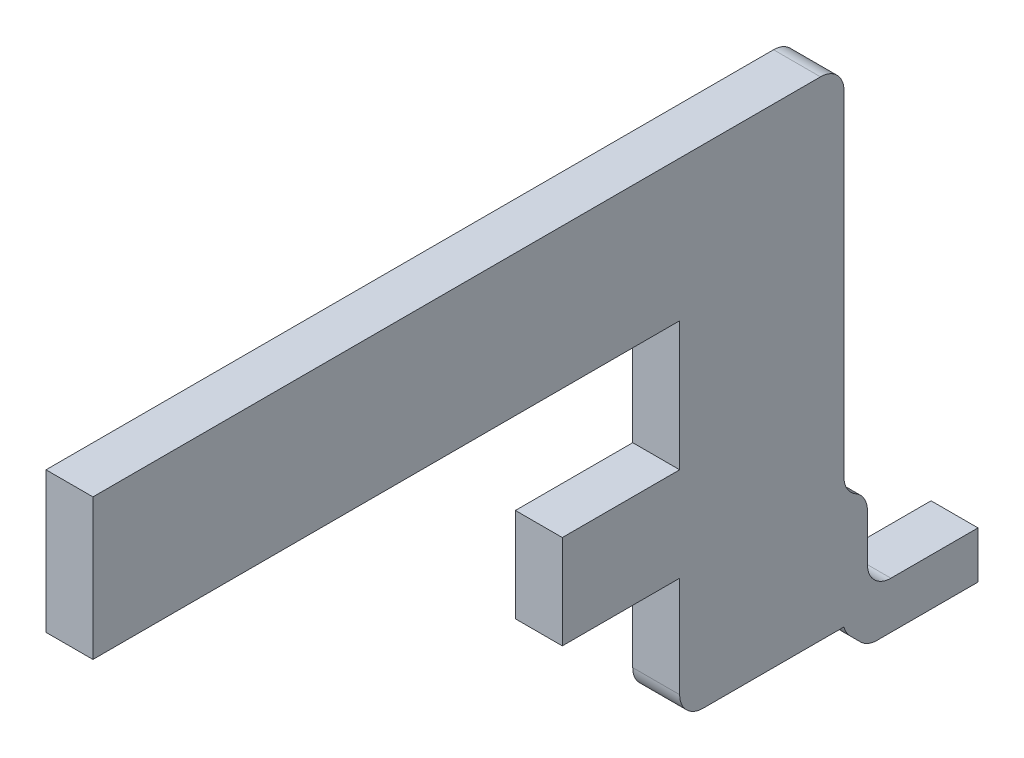
ISO-10303-21;
HEADER;
FILE_DESCRIPTION(('STEP AP214'),'2;1');
FILE_NAME('part.step','',(''),(''),'','','');
FILE_SCHEMA(('AUTOMOTIVE_DESIGN { 1 0 10303 214 1 1 1 1 }'));
ENDSEC;
DATA;
#1=APPLICATION_CONTEXT('core data for automotive mechanical design processes');
#2=APPLICATION_PROTOCOL_DEFINITION('international standard','automotive_design',2000,#1);
#3=PRODUCT_CONTEXT('',#1,'mechanical');
#4=PRODUCT('Part','Part','',(#3));
#5=PRODUCT_RELATED_PRODUCT_CATEGORY('part','',(#4));
#6=PRODUCT_DEFINITION_FORMATION('','',#4);
#7=PRODUCT_DEFINITION_CONTEXT('part definition',#1,'design');
#8=PRODUCT_DEFINITION('design','',#6,#7);
#9=PRODUCT_DEFINITION_SHAPE('','',#8);
#10=(LENGTH_UNIT() NAMED_UNIT(*) SI_UNIT(.MILLI.,.METRE.));
#11=(NAMED_UNIT(*) PLANE_ANGLE_UNIT() SI_UNIT($,.RADIAN.));
#12=(NAMED_UNIT(*) SI_UNIT($,.STERADIAN.) SOLID_ANGLE_UNIT());
#13=UNCERTAINTY_MEASURE_WITH_UNIT(LENGTH_MEASURE(1.E-05),#10,'distance_accuracy_value','');
#14=(GEOMETRIC_REPRESENTATION_CONTEXT(3) GLOBAL_UNCERTAINTY_ASSIGNED_CONTEXT((#13)) GLOBAL_UNIT_ASSIGNED_CONTEXT((#10,
#11,#12)) REPRESENTATION_CONTEXT('',''));
#15=CARTESIAN_POINT('',(0.,0.,0.));
#16=DIRECTION('',(0.,0.,1.));
#17=DIRECTION('',(1.,0.,0.));
#18=AXIS2_PLACEMENT_3D('',#15,#16,#17);
#19=CARTESIAN_POINT('',(3.4,2.1,-4.16));
#20=DIRECTION('',(1.,0.,0.));
#21=DIRECTION('',(0.,1.,0.));
#22=AXIS2_PLACEMENT_3D('',#19,#20,#21);
#23=CYLINDRICAL_SURFACE('',#22,0.1);
#24=CARTESIAN_POINT('',(3.4,2.1,-4.16));
#25=DIRECTION('',(-1.,0.,0.));
#26=DIRECTION('',(0.,1.,0.));
#27=AXIS2_PLACEMENT_3D('',#24,#25,#26);
#28=CIRCLE('',#27,0.1);
#29=CARTESIAN_POINT('',(3.4,2.2,-4.16));
#30=VERTEX_POINT('',#29);
#31=CARTESIAN_POINT('',(3.4,2.1,-4.26));
#32=VERTEX_POINT('',#31);
#33=EDGE_CURVE('E351',#30,#32,#28,.T.);
#34=ORIENTED_EDGE('',*,*,#33,.F.);
#35=DIRECTION('',(-1.,0.,0.));
#36=VECTOR('',#35,1.);
#37=CARTESIAN_POINT('',(3.5,2.2,-4.16));
#38=LINE('',#37,#36);
#39=CARTESIAN_POINT('',(3.6,2.2,-4.16));
#40=VERTEX_POINT('',#39);
#41=EDGE_CURVE('E352',#40,#30,#38,.T.);
#42=ORIENTED_EDGE('',*,*,#41,.F.);
#43=CARTESIAN_POINT('',(3.6,2.1,-4.16));
#44=DIRECTION('',(-1.,0.,0.));
#45=DIRECTION('',(0.,1.,0.));
#46=AXIS2_PLACEMENT_3D('',#43,#44,#45);
#47=CIRCLE('',#46,0.1);
#48=CARTESIAN_POINT('',(3.6,2.1,-4.26));
#49=VERTEX_POINT('',#48);
#50=EDGE_CURVE('E276',#40,#49,#47,.T.);
#51=ORIENTED_EDGE('',*,*,#50,.T.);
#52=DIRECTION('',(1.,0.,0.));
#53=VECTOR('',#52,1.);
#54=CARTESIAN_POINT('',(3.5,2.1,-4.26));
#55=LINE('',#54,#53);
#56=EDGE_CURVE('E11',#32,#49,#55,.T.);
#57=ORIENTED_EDGE('',*,*,#56,.F.);
#58=EDGE_LOOP('',(#34,#42,#51,#57));
#59=FACE_BOUND('',#58,.T.);
#60=ADVANCED_FACE('F16',(#59),#23,.T.);
#61=CARTESIAN_POINT('',(3.605378624359,2.128535898385,-4.26));
#62=DIRECTION('',(0.,0.,-1.));
#63=DIRECTION('',(0.,-1.,0.));
#64=AXIS2_PLACEMENT_3D('',#61,#62,#63);
#65=PLANE('',#64);
#66=DIRECTION('',(1.,0.,0.));
#67=VECTOR('',#66,1.);
#68=CARTESIAN_POINT('',(3.5,0.673205080757,-4.26));
#69=LINE('',#68,#67);
#70=CARTESIAN_POINT('',(3.4,0.673205080757,-4.26));
#71=VERTEX_POINT('',#70);
#72=CARTESIAN_POINT('',(3.6,0.673205080757,-4.26));
#73=VERTEX_POINT('',#72);
#74=EDGE_CURVE('E27',#71,#73,#69,.T.);
#75=ORIENTED_EDGE('',*,*,#74,.F.);
#76=DIRECTION('',(0.,1.,0.));
#77=VECTOR('',#76,1.);
#78=CARTESIAN_POINT('',(3.4,1.386602540379,-4.26));
#79=LINE('',#78,#77);
#80=EDGE_CURVE('E347',#71,#32,#79,.T.);
#81=ORIENTED_EDGE('',*,*,#80,.T.);
#82=ORIENTED_EDGE('',*,*,#56,.T.);
#83=DIRECTION('',(0.,-1.,0.));
#84=VECTOR('',#83,1.);
#85=CARTESIAN_POINT('',(3.6,1.1,-4.26));
#86=LINE('',#85,#84);
#87=EDGE_CURVE('E279',#49,#73,#86,.T.);
#88=ORIENTED_EDGE('',*,*,#87,.T.);
#89=EDGE_LOOP('',(#75,#81,#82,#88));
#90=FACE_BOUND('',#89,.T.);
#91=ADVANCED_FACE('F451',(#90),#65,.T.);
#92=CARTESIAN_POINT('',(3.4,0.673205080757,-4.36));
#93=DIRECTION('',(1.,0.,0.));
#94=DIRECTION('',(0.,1.,0.));
#95=AXIS2_PLACEMENT_3D('',#92,#93,#94);
#96=CYLINDRICAL_SURFACE('',#95,0.1);
#97=ORIENTED_EDGE('',*,*,#74,.T.);
#98=CARTESIAN_POINT('',(3.6,0.673205080757,-4.36));
#99=DIRECTION('',(1.,0.,0.));
#100=DIRECTION('',(0.,1.,0.));
#101=AXIS2_PLACEMENT_3D('',#98,#99,#100);
#102=CIRCLE('',#101,0.1);
#103=CARTESIAN_POINT('',(3.6,0.586602540378,-4.31));
#104=VERTEX_POINT('',#103);
#105=EDGE_CURVE('E296',#73,#104,#102,.T.);
#106=ORIENTED_EDGE('',*,*,#105,.T.);
#107=DIRECTION('',(-1.,0.,0.));
#108=VECTOR('',#107,1.);
#109=CARTESIAN_POINT('',(3.5,0.586602540378,-4.31));
#110=LINE('',#109,#108);
#111=CARTESIAN_POINT('',(3.4,0.586602540378,-4.31));
#112=VERTEX_POINT('',#111);
#113=EDGE_CURVE('E300',#104,#112,#110,.T.);
#114=ORIENTED_EDGE('',*,*,#113,.T.);
#115=CARTESIAN_POINT('',(3.4,0.673205080757,-4.36));
#116=DIRECTION('',(-1.,0.,0.));
#117=DIRECTION('',(0.,1.,0.));
#118=AXIS2_PLACEMENT_3D('',#115,#116,#117);
#119=CIRCLE('',#118,0.1);
#120=EDGE_CURVE('E350',#112,#71,#119,.T.);
#121=ORIENTED_EDGE('',*,*,#120,.T.);
#122=EDGE_LOOP('',(#97,#106,#114,#121));
#123=FACE_BOUND('',#122,.T.);
#124=ADVANCED_FACE('F439',(#123),#96,.F.);
#125=CARTESIAN_POINT('',(3.4,0.5,-4.26));
#126=DIRECTION('',(1.,0.,0.));
#127=DIRECTION('',(0.,1.,0.));
#128=AXIS2_PLACEMENT_3D('',#125,#126,#127);
#129=CYLINDRICAL_SURFACE('',#128,0.1);
#130=DIRECTION('',(1.,0.,0.));
#131=VECTOR('',#130,1.);
#132=CARTESIAN_POINT('',(3.5,0.5,-4.36));
#133=LINE('',#132,#131);
#134=CARTESIAN_POINT('',(3.4,0.5,-4.36));
#135=VERTEX_POINT('',#134);
#136=CARTESIAN_POINT('',(3.6,0.5,-4.36));
#137=VERTEX_POINT('',#136);
#138=EDGE_CURVE('E297',#135,#137,#133,.T.);
#139=ORIENTED_EDGE('',*,*,#138,.F.);
#140=CARTESIAN_POINT('',(3.4,0.5,-4.26));
#141=DIRECTION('',(-1.,0.,0.));
#142=DIRECTION('',(0.,1.,0.));
#143=AXIS2_PLACEMENT_3D('',#140,#141,#142);
#144=CIRCLE('',#143,0.1);
#145=EDGE_CURVE('E291',#112,#135,#144,.T.);
#146=ORIENTED_EDGE('',*,*,#145,.F.);
#147=ORIENTED_EDGE('',*,*,#113,.F.);
#148=CARTESIAN_POINT('',(3.6,0.5,-4.26));
#149=DIRECTION('',(-1.,0.,0.));
#150=DIRECTION('',(0.,1.,0.));
#151=AXIS2_PLACEMENT_3D('',#148,#149,#150);
#152=CIRCLE('',#151,0.1);
#153=EDGE_CURVE('E358',#104,#137,#152,.T.);
#154=ORIENTED_EDGE('',*,*,#153,.T.);
#155=EDGE_LOOP('',(#139,#146,#147,#154));
#156=FACE_BOUND('',#155,.T.);
#157=ADVANCED_FACE('F446',(#156),#129,.T.);
#158=CARTESIAN_POINT('',(3.605378624359,0.505378624359,-4.36));
#159=DIRECTION('',(0.,0.,-1.));
#160=DIRECTION('',(0.,-1.,0.));
#161=AXIS2_PLACEMENT_3D('',#158,#159,#160);
#162=PLANE('',#161);
#163=DIRECTION('',(1.,0.,0.));
#164=VECTOR('',#163,1.);
#165=CARTESIAN_POINT('',(3.5,0.3,-4.36));
#166=LINE('',#165,#164);
#167=CARTESIAN_POINT('',(3.4,0.3,-4.36));
#168=VERTEX_POINT('',#167);
#169=CARTESIAN_POINT('',(3.6,0.3,-4.36));
#170=VERTEX_POINT('',#169);
#171=EDGE_CURVE('E301',#168,#170,#166,.T.);
#172=ORIENTED_EDGE('',*,*,#171,.F.);
#173=DIRECTION('',(0.,1.,0.));
#174=VECTOR('',#173,1.);
#175=CARTESIAN_POINT('',(3.4,0.4,-4.36));
#176=LINE('',#175,#174);
#177=EDGE_CURVE('E286',#168,#135,#176,.T.);
#178=ORIENTED_EDGE('',*,*,#177,.T.);
#179=ORIENTED_EDGE('',*,*,#138,.T.);
#180=DIRECTION('',(0.,-1.,0.));
#181=VECTOR('',#180,1.);
#182=CARTESIAN_POINT('',(3.6,1.1,-4.36));
#183=LINE('',#182,#181);
#184=EDGE_CURVE('E362',#137,#170,#183,.T.);
#185=ORIENTED_EDGE('',*,*,#184,.T.);
#186=EDGE_LOOP('',(#172,#178,#179,#185));
#187=FACE_BOUND('',#186,.T.);
#188=ADVANCED_FACE('F485',(#187),#162,.T.);
#189=CARTESIAN_POINT('',(3.6,0.3,-4.46));
#190=DIRECTION('',(-1.,0.,0.));
#191=DIRECTION('',(0.,0.,1.));
#192=AXIS2_PLACEMENT_3D('',#189,#190,#191);
#193=CYLINDRICAL_SURFACE('',#192,0.1);
#194=DIRECTION('',(1.,0.,0.));
#195=VECTOR('',#194,1.);
#196=CARTESIAN_POINT('',(3.5,0.2,-4.46));
#197=LINE('',#196,#195);
#198=CARTESIAN_POINT('',(3.4,0.2,-4.46));
#199=VERTEX_POINT('',#198);
#200=CARTESIAN_POINT('',(3.6,0.2,-4.46));
#201=VERTEX_POINT('',#200);
#202=EDGE_CURVE('E202',#199,#201,#197,.T.);
#203=ORIENTED_EDGE('',*,*,#202,.F.);
#204=CARTESIAN_POINT('',(3.4,0.3,-4.46));
#205=DIRECTION('',(-1.,0.,0.));
#206=DIRECTION('',(0.,0.,1.));
#207=AXIS2_PLACEMENT_3D('',#204,#205,#206);
#208=CIRCLE('',#207,0.1);
#209=EDGE_CURVE('E290',#199,#168,#208,.T.);
#210=ORIENTED_EDGE('',*,*,#209,.T.);
#211=ORIENTED_EDGE('',*,*,#171,.T.);
#212=CARTESIAN_POINT('',(3.6,0.3,-4.46));
#213=DIRECTION('',(1.,0.,0.));
#214=DIRECTION('',(0.,0.,1.));
#215=AXIS2_PLACEMENT_3D('',#212,#213,#214);
#216=CIRCLE('',#215,0.1);
#217=EDGE_CURVE('E403',#170,#201,#216,.T.);
#218=ORIENTED_EDGE('',*,*,#217,.T.);
#219=EDGE_LOOP('',(#203,#210,#211,#218));
#220=FACE_BOUND('',#219,.T.);
#221=ADVANCED_FACE('F484',(#220),#193,.F.);
#222=CARTESIAN_POINT('',(3.605378624359,0.2,-4.452));
#223=DIRECTION('',(0.,1.,0.));
#224=DIRECTION('',(1.,0.,0.));
#225=AXIS2_PLACEMENT_3D('',#222,#223,#224);
#226=PLANE('',#225);
#227=DIRECTION('',(-0.999999999999985,0.,-1.74845542030845E-07));
#228=VECTOR('',#227,1.);
#229=CARTESIAN_POINT('',(2.33759477520908,0.2,-4.83118914513339));
#230=LINE('',#229,#228);
#231=CARTESIAN_POINT('',(3.6,0.2,-4.83118892440746));
#232=VERTEX_POINT('',#231);
#233=CARTESIAN_POINT('',(3.4,0.2,-4.83118895937657));
#234=VERTEX_POINT('',#233);
#235=EDGE_CURVE('E266',#232,#234,#230,.T.);
#236=ORIENTED_EDGE('',*,*,#235,.T.);
#237=DIRECTION('',(0.,0.,1.));
#238=VECTOR('',#237,1.);
#239=CARTESIAN_POINT('',(3.4,0.2,-4.66));
#240=LINE('',#239,#238);
#241=EDGE_CURVE('E243',#234,#199,#240,.T.);
#242=ORIENTED_EDGE('',*,*,#241,.T.);
#243=ORIENTED_EDGE('',*,*,#202,.T.);
#244=DIRECTION('',(0.,0.,-1.));
#245=VECTOR('',#244,1.);
#246=CARTESIAN_POINT('',(3.6,0.2,-3.01));
#247=LINE('',#246,#245);
#248=EDGE_CURVE('E402',#201,#232,#247,.T.);
#249=ORIENTED_EDGE('',*,*,#248,.T.);
#250=EDGE_LOOP('',(#236,#242,#243,#249));
#251=FACE_BOUND('',#250,.T.);
#252=ADVANCED_FACE('F483',(#251),#226,.T.);
#253=CARTESIAN_POINT('',(3.6,0.1,-4.401421356237));
#254=DIRECTION('',(-1.,0.,0.));
#255=DIRECTION('',(0.,0.,1.));
#256=AXIS2_PLACEMENT_3D('',#253,#254,#255);
#257=CYLINDRICAL_SURFACE('',#256,0.1);
#258=CARTESIAN_POINT('',(3.6,0.1,-4.401421356237));
#259=DIRECTION('',(-1.,0.,0.));
#260=DIRECTION('',(0.,0.,1.));
#261=AXIS2_PLACEMENT_3D('',#258,#259,#260);
#262=CIRCLE('',#261,0.1);
#263=CARTESIAN_POINT('',(3.6,0.,-4.401421356237));
#264=VERTEX_POINT('',#263);
#265=CARTESIAN_POINT('',(3.6,0.02928932188137,-4.330710678119));
#266=VERTEX_POINT('',#265);
#267=EDGE_CURVE('E190',#264,#266,#262,.T.);
#268=ORIENTED_EDGE('',*,*,#267,.T.);
#269=DIRECTION('',(1.,0.,0.));
#270=VECTOR('',#269,1.);
#271=CARTESIAN_POINT('',(3.5,0.02928932188135,-4.330710678119));
#272=LINE('',#271,#270);
#273=CARTESIAN_POINT('',(3.4,0.02928932188137,-4.330710678119));
#274=VERTEX_POINT('',#273);
#275=EDGE_CURVE('E41',#274,#266,#272,.T.);
#276=ORIENTED_EDGE('',*,*,#275,.F.);
#277=CARTESIAN_POINT('',(3.4,0.1,-4.401421356237));
#278=DIRECTION('',(-1.,0.,0.));
#279=DIRECTION('',(0.,0.,1.));
#280=AXIS2_PLACEMENT_3D('',#277,#278,#279);
#281=CIRCLE('',#280,0.1);
#282=CARTESIAN_POINT('',(3.4,0.,-4.401421356237));
#283=VERTEX_POINT('',#282);
#284=EDGE_CURVE('E302',#283,#274,#281,.T.);
#285=ORIENTED_EDGE('',*,*,#284,.F.);
#286=DIRECTION('',(-1.,0.,0.));
#287=VECTOR('',#286,1.);
#288=CARTESIAN_POINT('',(3.5,0.,-4.401421356237));
#289=LINE('',#288,#287);
#290=EDGE_CURVE('E255',#264,#283,#289,.T.);
#291=ORIENTED_EDGE('',*,*,#290,.F.);
#292=EDGE_LOOP('',(#268,#276,#285,#291));
#293=FACE_BOUND('',#292,.T.);
#294=ADVANCED_FACE('F514',(#293),#257,.T.);
#295=CARTESIAN_POINT('',(3.605378624359,0.02548606012333,-4.334513939877));
#296=DIRECTION('',(0.,-0.707106781189048,0.707106781184048));
#297=DIRECTION('',(-1.,0.,0.));
#298=AXIS2_PLACEMENT_3D('',#295,#296,#297);
#299=PLANE('',#298);
#300=DIRECTION('',(-1.,0.,0.));
#301=VECTOR('',#300,1.);
#302=CARTESIAN_POINT('',(3.5,0.0737479164408,-4.286252083559));
#303=LINE('',#302,#301);
#304=CARTESIAN_POINT('',(3.6,0.07374791644068,-4.286252083559));
#305=VERTEX_POINT('',#304);
#306=CARTESIAN_POINT('',(3.4,0.07374791644067,-4.286252083559));
#307=VERTEX_POINT('',#306);
#308=EDGE_CURVE('E312',#305,#307,#303,.T.);
#309=ORIENTED_EDGE('',*,*,#308,.T.);
#310=DIRECTION('',(0.,-0.707106781184048,-0.707106781189048));
#311=VECTOR('',#310,1.);
#312=CARTESIAN_POINT('',(3.4,0.05151861916115,-4.308481380839));
#313=LINE('',#312,#311);
#314=EDGE_CURVE('E306',#307,#274,#313,.T.);
#315=ORIENTED_EDGE('',*,*,#314,.T.);
#316=ORIENTED_EDGE('',*,*,#275,.T.);
#317=DIRECTION('',(0.,0.707106781184048,0.707106781189048));
#318=VECTOR('',#317,1.);
#319=CARTESIAN_POINT('',(3.6,0.02548606012333,-4.334513939877));
#320=LINE('',#319,#318);
#321=EDGE_CURVE('E284',#266,#305,#320,.T.);
#322=ORIENTED_EDGE('',*,*,#321,.T.);
#323=EDGE_LOOP('',(#309,#315,#316,#322));
#324=FACE_BOUND('',#323,.T.);
#325=ADVANCED_FACE('F511',(#324),#299,.T.);
#326=CARTESIAN_POINT('',(3.4,0.14445859456,-4.356962761678));
#327=DIRECTION('',(1.,0.,0.));
#328=DIRECTION('',(0.,1.,0.));
#329=AXIS2_PLACEMENT_3D('',#326,#327,#328);
#330=CYLINDRICAL_SURFACE('',#329,0.1);
#331=CARTESIAN_POINT('',(3.4,0.14445859456,-4.356962761678));
#332=DIRECTION('',(-1.,0.,0.));
#333=DIRECTION('',(0.,1.,0.));
#334=AXIS2_PLACEMENT_3D('',#331,#332,#333);
#335=CIRCLE('',#334,0.1);
#336=CARTESIAN_POINT('',(3.4,0.12,-4.26));
#337=VERTEX_POINT('',#336);
#338=EDGE_CURVE('E316',#307,#337,#335,.T.);
#339=ORIENTED_EDGE('',*,*,#338,.F.);
#340=ORIENTED_EDGE('',*,*,#308,.F.);
#341=CARTESIAN_POINT('',(3.6,0.14445859456,-4.356962761678));
#342=DIRECTION('',(-1.,0.,0.));
#343=DIRECTION('',(0.,1.,0.));
#344=AXIS2_PLACEMENT_3D('',#341,#342,#343);
#345=CIRCLE('',#344,0.1);
#346=CARTESIAN_POINT('',(3.6,0.12,-4.26));
#347=VERTEX_POINT('',#346);
#348=EDGE_CURVE('E280',#305,#347,#345,.T.);
#349=ORIENTED_EDGE('',*,*,#348,.T.);
#350=DIRECTION('',(-1.,0.,0.));
#351=VECTOR('',#350,1.);
#352=CARTESIAN_POINT('',(3.5,0.12,-4.26));
#353=LINE('',#352,#351);
#354=EDGE_CURVE('E315',#347,#337,#353,.T.);
#355=ORIENTED_EDGE('',*,*,#354,.T.);
#356=EDGE_LOOP('',(#339,#340,#349,#355));
#357=FACE_BOUND('',#356,.T.);
#358=ADVANCED_FACE('F510',(#357),#330,.T.);
#359=CARTESIAN_POINT('',(3.605378624359,0.12,-3.648));
#360=DIRECTION('',(0.,1.,0.));
#361=DIRECTION('',(1.,0.,0.));
#362=AXIS2_PLACEMENT_3D('',#359,#360,#361);
#363=PLANE('',#362);
#364=DIRECTION('',(-1.,0.,0.));
#365=VECTOR('',#364,1.);
#366=CARTESIAN_POINT('',(3.5,0.12,-3.66));
#367=LINE('',#366,#365);
#368=CARTESIAN_POINT('',(3.6,0.12,-3.66));
#369=VERTEX_POINT('',#368);
#370=CARTESIAN_POINT('',(3.4,0.12,-3.66));
#371=VERTEX_POINT('',#370);
#372=EDGE_CURVE('E108',#369,#371,#367,.T.);
#373=ORIENTED_EDGE('',*,*,#372,.T.);
#374=DIRECTION('',(0.,0.,1.));
#375=VECTOR('',#374,1.);
#376=CARTESIAN_POINT('',(3.4,0.12,-3.96));
#377=LINE('',#376,#375);
#378=EDGE_CURVE('E320',#337,#371,#377,.T.);
#379=ORIENTED_EDGE('',*,*,#378,.F.);
#380=ORIENTED_EDGE('',*,*,#354,.F.);
#381=DIRECTION('',(0.,0.,1.));
#382=VECTOR('',#381,1.);
#383=CARTESIAN_POINT('',(3.6,0.12,-3.01));
#384=LINE('',#383,#382);
#385=EDGE_CURVE('E285',#347,#369,#384,.T.);
#386=ORIENTED_EDGE('',*,*,#385,.T.);
#387=EDGE_LOOP('',(#373,#379,#380,#386));
#388=FACE_BOUND('',#387,.T.);
#389=ADVANCED_FACE('F534',(#388),#363,.F.);
#390=CARTESIAN_POINT('',(3.4,0.22,-3.66));
#391=DIRECTION('',(1.,0.,0.));
#392=DIRECTION('',(0.,1.,0.));
#393=AXIS2_PLACEMENT_3D('',#390,#391,#392);
#394=CYLINDRICAL_SURFACE('',#393,0.1);
#395=CARTESIAN_POINT('',(3.4,0.22,-3.66));
#396=DIRECTION('',(-1.,0.,0.));
#397=DIRECTION('',(0.,1.,0.));
#398=AXIS2_PLACEMENT_3D('',#395,#396,#397);
#399=CIRCLE('',#398,0.1);
#400=CARTESIAN_POINT('',(3.4,0.22,-3.56));
#401=VERTEX_POINT('',#400);
#402=EDGE_CURVE('E338',#371,#401,#399,.T.);
#403=ORIENTED_EDGE('',*,*,#402,.F.);
#404=ORIENTED_EDGE('',*,*,#372,.F.);
#405=CARTESIAN_POINT('',(3.6,0.22,-3.66));
#406=DIRECTION('',(-1.,0.,0.));
#407=DIRECTION('',(0.,1.,0.));
#408=AXIS2_PLACEMENT_3D('',#405,#406,#407);
#409=CIRCLE('',#408,0.1);
#410=CARTESIAN_POINT('',(3.6,0.22,-3.56));
#411=VERTEX_POINT('',#410);
#412=EDGE_CURVE('E321',#369,#411,#409,.T.);
#413=ORIENTED_EDGE('',*,*,#412,.T.);
#414=DIRECTION('',(1.,0.,0.));
#415=VECTOR('',#414,1.);
#416=CARTESIAN_POINT('',(3.5,0.22,-3.56));
#417=LINE('',#416,#415);
#418=EDGE_CURVE('E120',#401,#411,#417,.T.);
#419=ORIENTED_EDGE('',*,*,#418,.F.);
#420=EDGE_LOOP('',(#403,#404,#413,#419));
#421=FACE_BOUND('',#420,.T.);
#422=ADVANCED_FACE('F537',(#421),#394,.T.);
#423=CARTESIAN_POINT('',(3.605378624359,0.2114,-3.56));
#424=DIRECTION('',(0.,0.,1.));
#425=DIRECTION('',(1.,0.,0.));
#426=AXIS2_PLACEMENT_3D('',#423,#424,#425);
#427=PLANE('',#426);
#428=DIRECTION('',(1.,0.,0.));
#429=VECTOR('',#428,1.);
#430=CARTESIAN_POINT('',(3.5,0.65,-3.56));
#431=LINE('',#430,#429);
#432=CARTESIAN_POINT('',(3.4,0.65,-3.56));
#433=VERTEX_POINT('',#432);
#434=CARTESIAN_POINT('',(3.6,0.65,-3.56));
#435=VERTEX_POINT('',#434);
#436=EDGE_CURVE('E274',#433,#435,#431,.T.);
#437=ORIENTED_EDGE('',*,*,#436,.F.);
#438=DIRECTION('',(0.,-1.,0.));
#439=VECTOR('',#438,1.);
#440=CARTESIAN_POINT('',(3.4,0.435,-3.56));
#441=LINE('',#440,#439);
#442=EDGE_CURVE('E334',#433,#401,#441,.T.);
#443=ORIENTED_EDGE('',*,*,#442,.T.);
#444=ORIENTED_EDGE('',*,*,#418,.T.);
#445=DIRECTION('',(0.,1.,0.));
#446=VECTOR('',#445,1.);
#447=CARTESIAN_POINT('',(3.6,1.1,-3.56));
#448=LINE('',#447,#446);
#449=EDGE_CURVE('E324',#411,#435,#448,.T.);
#450=ORIENTED_EDGE('',*,*,#449,.T.);
#451=EDGE_LOOP('',(#437,#443,#444,#450));
#452=FACE_BOUND('',#451,.T.);
#453=ADVANCED_FACE('F531',(#452),#427,.T.);
#454=CARTESIAN_POINT('',(3.605378624359,0.65,-3.57));
#455=DIRECTION('',(0.,-1.,0.));
#456=DIRECTION('',(0.,0.,-1.));
#457=AXIS2_PLACEMENT_3D('',#454,#455,#456);
#458=PLANE('',#457);
#459=DIRECTION('',(0.,0.,-1.));
#460=VECTOR('',#459,1.);
#461=CARTESIAN_POINT('',(3.4,0.65,-3.31));
#462=LINE('',#461,#460);
#463=CARTESIAN_POINT('',(3.4,0.65,-3.06));
#464=VERTEX_POINT('',#463);
#465=EDGE_CURVE('E337',#464,#433,#462,.T.);
#466=ORIENTED_EDGE('',*,*,#465,.T.);
#467=ORIENTED_EDGE('',*,*,#436,.T.);
#468=DIRECTION('',(0.,0.,1.));
#469=VECTOR('',#468,1.);
#470=CARTESIAN_POINT('',(3.6,0.65,-3.01));
#471=LINE('',#470,#469);
#472=CARTESIAN_POINT('',(3.6,0.65,-3.06));
#473=VERTEX_POINT('',#472);
#474=EDGE_CURVE('E377',#435,#473,#471,.T.);
#475=ORIENTED_EDGE('',*,*,#474,.T.);
#476=DIRECTION('',(1.,0.,0.));
#477=VECTOR('',#476,1.);
#478=CARTESIAN_POINT('',(3.5,0.65,-3.06));
#479=LINE('',#478,#477);
#480=EDGE_CURVE('E310',#464,#473,#479,.T.);
#481=ORIENTED_EDGE('',*,*,#480,.F.);
#482=EDGE_LOOP('',(#466,#467,#475,#481));
#483=FACE_BOUND('',#482,.T.);
#484=ADVANCED_FACE('F528',(#483),#458,.T.);
#485=CARTESIAN_POINT('',(3.605378624359,0.642,-3.06));
#486=DIRECTION('',(0.,0.,1.));
#487=DIRECTION('',(1.,0.,0.));
#488=AXIS2_PLACEMENT_3D('',#485,#486,#487);
#489=PLANE('',#488);
#490=DIRECTION('',(0.,-1.,0.));
#491=VECTOR('',#490,1.);
#492=CARTESIAN_POINT('',(3.4,0.85,-3.06));
#493=LINE('',#492,#491);
#494=CARTESIAN_POINT('',(3.4,1.05,-3.06));
#495=VERTEX_POINT('',#494);
#496=EDGE_CURVE('E370',#495,#464,#493,.T.);
#497=ORIENTED_EDGE('',*,*,#496,.T.);
#498=ORIENTED_EDGE('',*,*,#480,.T.);
#499=DIRECTION('',(0.,1.,0.));
#500=VECTOR('',#499,1.);
#501=CARTESIAN_POINT('',(3.6,1.1,-3.06));
#502=LINE('',#501,#500);
#503=CARTESIAN_POINT('',(3.6,1.05,-3.06));
#504=VERTEX_POINT('',#503);
#505=EDGE_CURVE('E431',#473,#504,#502,.T.);
#506=ORIENTED_EDGE('',*,*,#505,.T.);
#507=DIRECTION('',(1.,0.,0.));
#508=VECTOR('',#507,1.);
#509=CARTESIAN_POINT('',(3.5,1.05,-3.06));
#510=LINE('',#509,#508);
#511=EDGE_CURVE('E307',#495,#504,#510,.T.);
#512=ORIENTED_EDGE('',*,*,#511,.F.);
#513=EDGE_LOOP('',(#497,#498,#506,#512));
#514=FACE_BOUND('',#513,.T.);
#515=ADVANCED_FACE('F530',(#514),#489,.T.);
#516=CARTESIAN_POINT('',(3.605378624359,1.05,-3.05));
#517=DIRECTION('',(0.,1.,0.));
#518=DIRECTION('',(1.,0.,0.));
#519=AXIS2_PLACEMENT_3D('',#516,#517,#518);
#520=PLANE('',#519);
#521=DIRECTION('',(0.,0.,1.));
#522=VECTOR('',#521,1.);
#523=CARTESIAN_POINT('',(3.4,1.05,-3.31));
#524=LINE('',#523,#522);
#525=CARTESIAN_POINT('',(3.4,1.05,-3.56));
#526=VERTEX_POINT('',#525);
#527=EDGE_CURVE('E374',#526,#495,#524,.T.);
#528=ORIENTED_EDGE('',*,*,#527,.T.);
#529=ORIENTED_EDGE('',*,*,#511,.T.);
#530=DIRECTION('',(0.,0.,-1.));
#531=VECTOR('',#530,1.);
#532=CARTESIAN_POINT('',(3.6,1.05,-3.01));
#533=LINE('',#532,#531);
#534=CARTESIAN_POINT('',(3.6,1.05,-3.56));
#535=VERTEX_POINT('',#534);
#536=EDGE_CURVE('E342',#504,#535,#533,.T.);
#537=ORIENTED_EDGE('',*,*,#536,.T.);
#538=DIRECTION('',(1.,0.,0.));
#539=VECTOR('',#538,1.);
#540=CARTESIAN_POINT('',(3.5,1.05,-3.56));
#541=LINE('',#540,#539);
#542=EDGE_CURVE('E311',#526,#535,#541,.T.);
#543=ORIENTED_EDGE('',*,*,#542,.F.);
#544=EDGE_LOOP('',(#528,#529,#537,#543));
#545=FACE_BOUND('',#544,.T.);
#546=ADVANCED_FACE('F526',(#545),#520,.T.);
#547=CARTESIAN_POINT('',(3.605378624359,1.039,-3.56));
#548=DIRECTION('',(0.,0.,1.));
#549=DIRECTION('',(1.,0.,0.));
#550=AXIS2_PLACEMENT_3D('',#547,#548,#549);
#551=PLANE('',#550);
#552=DIRECTION('',(0.,-1.,0.));
#553=VECTOR('',#552,1.);
#554=CARTESIAN_POINT('',(3.4,1.325,-3.56));
#555=LINE('',#554,#553);
#556=CARTESIAN_POINT('',(3.4,1.6,-3.56));
#557=VERTEX_POINT('',#556);
#558=EDGE_CURVE('E20',#557,#526,#555,.T.);
#559=ORIENTED_EDGE('',*,*,#558,.T.);
#560=ORIENTED_EDGE('',*,*,#542,.T.);
#561=DIRECTION('',(0.,1.,0.));
#562=VECTOR('',#561,1.);
#563=CARTESIAN_POINT('',(3.6,1.1,-3.56));
#564=LINE('',#563,#562);
#565=CARTESIAN_POINT('',(3.6,1.6,-3.56));
#566=VERTEX_POINT('',#565);
#567=EDGE_CURVE('E339',#535,#566,#564,.T.);
#568=ORIENTED_EDGE('',*,*,#567,.T.);
#569=DIRECTION('',(1.,0.,0.));
#570=VECTOR('',#569,1.);
#571=CARTESIAN_POINT('',(3.5,1.6,-3.56));
#572=LINE('',#571,#570);
#573=EDGE_CURVE('E387',#557,#566,#572,.T.);
#574=ORIENTED_EDGE('',*,*,#573,.F.);
#575=EDGE_LOOP('',(#559,#560,#568,#574));
#576=FACE_BOUND('',#575,.T.);
#577=ADVANCED_FACE('F519',(#576),#551,.T.);
#578=CARTESIAN_POINT('',(3.605378624359,1.6,-3.61));
#579=DIRECTION('',(0.,-1.,0.));
#580=DIRECTION('',(0.,0.,-1.));
#581=AXIS2_PLACEMENT_3D('',#578,#579,#580);
#582=PLANE('',#581);
#583=DIRECTION('',(0.,0.,-1.));
#584=VECTOR('',#583,1.);
#585=CARTESIAN_POINT('',(3.4,1.6,-2.31));
#586=LINE('',#585,#584);
#587=CARTESIAN_POINT('',(3.4,1.6,-1.06));
#588=VERTEX_POINT('',#587);
#589=EDGE_CURVE('E327',#588,#557,#586,.T.);
#590=ORIENTED_EDGE('',*,*,#589,.T.);
#591=ORIENTED_EDGE('',*,*,#573,.T.);
#592=DIRECTION('',(0.,0.,1.));
#593=VECTOR('',#592,1.);
#594=CARTESIAN_POINT('',(3.6,1.6,-3.01));
#595=LINE('',#594,#593);
#596=CARTESIAN_POINT('',(3.6,1.6,-1.06));
#597=VERTEX_POINT('',#596);
#598=EDGE_CURVE('E343',#566,#597,#595,.T.);
#599=ORIENTED_EDGE('',*,*,#598,.T.);
#600=DIRECTION('',(1.,0.,0.));
#601=VECTOR('',#600,1.);
#602=CARTESIAN_POINT('',(3.5,1.6,-1.06));
#603=LINE('',#602,#601);
#604=EDGE_CURVE('E379',#588,#597,#603,.T.);
#605=ORIENTED_EDGE('',*,*,#604,.F.);
#606=EDGE_LOOP('',(#590,#591,#599,#605));
#607=FACE_BOUND('',#606,.T.);
#608=ADVANCED_FACE('F515',(#607),#582,.T.);
#609=CARTESIAN_POINT('',(3.605378624359,1.588,-1.06));
#610=DIRECTION('',(0.,0.,1.));
#611=DIRECTION('',(1.,0.,0.));
#612=AXIS2_PLACEMENT_3D('',#609,#610,#611);
#613=PLANE('',#612);
#614=DIRECTION('',(0.,-1.,0.));
#615=VECTOR('',#614,1.);
#616=CARTESIAN_POINT('',(3.4,1.9,-1.06));
#617=LINE('',#616,#615);
#618=CARTESIAN_POINT('',(3.4,2.2,-1.06));
#619=VERTEX_POINT('',#618);
#620=EDGE_CURVE('E331',#619,#588,#617,.T.);
#621=ORIENTED_EDGE('',*,*,#620,.T.);
#622=ORIENTED_EDGE('',*,*,#604,.T.);
#623=DIRECTION('',(0.,1.,0.));
#624=VECTOR('',#623,1.);
#625=CARTESIAN_POINT('',(3.6,1.1,-1.06));
#626=LINE('',#625,#624);
#627=CARTESIAN_POINT('',(3.6,2.2,-1.06));
#628=VERTEX_POINT('',#627);
#629=EDGE_CURVE('E400',#597,#628,#626,.T.);
#630=ORIENTED_EDGE('',*,*,#629,.T.);
#631=DIRECTION('',(1.,0.,0.));
#632=VECTOR('',#631,1.);
#633=CARTESIAN_POINT('',(3.5,2.2,-1.06));
#634=LINE('',#633,#632);
#635=EDGE_CURVE('E355',#619,#628,#634,.T.);
#636=ORIENTED_EDGE('',*,*,#635,.F.);
#637=EDGE_LOOP('',(#621,#622,#630,#636));
#638=FACE_BOUND('',#637,.T.);
#639=ADVANCED_FACE('F518',(#638),#613,.T.);
#640=CARTESIAN_POINT('',(3.605378624359,2.2,-0.998));
#641=DIRECTION('',(0.,1.,0.));
#642=DIRECTION('',(1.,0.,0.));
#643=AXIS2_PLACEMENT_3D('',#640,#641,#642);
#644=PLANE('',#643);
#645=DIRECTION('',(0.,0.,-1.));
#646=VECTOR('',#645,1.);
#647=CARTESIAN_POINT('',(3.6,2.2,-3.01));
#648=LINE('',#647,#646);
#649=EDGE_CURVE('E278',#628,#40,#648,.T.);
#650=ORIENTED_EDGE('',*,*,#649,.T.);
#651=ORIENTED_EDGE('',*,*,#41,.T.);
#652=DIRECTION('',(0.,0.,1.));
#653=VECTOR('',#652,1.);
#654=CARTESIAN_POINT('',(3.4,2.2,-2.61));
#655=LINE('',#654,#653);
#656=EDGE_CURVE('E406',#30,#619,#655,.T.);
#657=ORIENTED_EDGE('',*,*,#656,.T.);
#658=ORIENTED_EDGE('',*,*,#635,.T.);
#659=EDGE_LOOP('',(#650,#651,#657,#658));
#660=FACE_BOUND('',#659,.T.);
#661=ADVANCED_FACE('F523',(#660),#644,.T.);
#662=CARTESIAN_POINT('',(3.6,-0.044,-5.038));
#663=DIRECTION('',(-1.,0.,0.));
#664=DIRECTION('',(0.,0.,1.));
#665=AXIS2_PLACEMENT_3D('',#662,#663,#664);
#666=PLANE('',#665);
#667=DIRECTION('',(0.,1.,1.31134142902603E-07));
#668=VECTOR('',#667,1.);
#669=CARTESIAN_POINT('',(3.6,-0.66798968893855,-4.83118903823055));
#670=LINE('',#669,#668);
#671=CARTESIAN_POINT('',(3.6,0.,-4.83118895063429));
#672=VERTEX_POINT('',#671);
#673=EDGE_CURVE('E253',#672,#232,#670,.T.);
#674=ORIENTED_EDGE('',*,*,#673,.T.);
#675=ORIENTED_EDGE('',*,*,#248,.F.);
#676=ORIENTED_EDGE('',*,*,#217,.F.);
#677=ORIENTED_EDGE('',*,*,#184,.F.);
#678=ORIENTED_EDGE('',*,*,#153,.F.);
#679=ORIENTED_EDGE('',*,*,#105,.F.);
#680=ORIENTED_EDGE('',*,*,#87,.F.);
#681=ORIENTED_EDGE('',*,*,#50,.F.);
#682=ORIENTED_EDGE('',*,*,#649,.F.);
#683=ORIENTED_EDGE('',*,*,#629,.F.);
#684=ORIENTED_EDGE('',*,*,#598,.F.);
#685=ORIENTED_EDGE('',*,*,#567,.F.);
#686=ORIENTED_EDGE('',*,*,#536,.F.);
#687=ORIENTED_EDGE('',*,*,#505,.F.);
#688=ORIENTED_EDGE('',*,*,#474,.F.);
#689=ORIENTED_EDGE('',*,*,#449,.F.);
#690=ORIENTED_EDGE('',*,*,#412,.F.);
#691=ORIENTED_EDGE('',*,*,#385,.F.);
#692=ORIENTED_EDGE('',*,*,#348,.F.);
#693=ORIENTED_EDGE('',*,*,#321,.F.);
#694=ORIENTED_EDGE('',*,*,#267,.F.);
#695=DIRECTION('',(0.,0.,1.));
#696=VECTOR('',#695,1.);
#697=CARTESIAN_POINT('',(3.6,0.,-3.01));
#698=LINE('',#697,#696);
#699=EDGE_CURVE('E249',#672,#264,#698,.T.);
#700=ORIENTED_EDGE('',*,*,#699,.F.);
#701=EDGE_LOOP('',(#674,#675,#676,#677,#678,#679,#680,#681,#682,#683,#684,#685,#686,#687,#688,
#689,#690,#691,#692,#693,#694,#700));
#702=FACE_BOUND('',#701,.T.);
#703=ADVANCED_FACE('F250',(#702),#666,.F.);
#704=CARTESIAN_POINT('',(3.605378624359,0.,-4.869171572875));
#705=DIRECTION('',(0.,-1.,0.));
#706=DIRECTION('',(0.,0.,-1.));
#707=AXIS2_PLACEMENT_3D('',#704,#705,#706);
#708=PLANE('',#707);
#709=DIRECTION('',(0.999999999999985,0.,1.74845542030845E-07));
#710=VECTOR('',#709,1.);
#711=CARTESIAN_POINT('',(2.33759473873879,0.,-4.83118917136022));
#712=LINE('',#711,#710);
#713=CARTESIAN_POINT('',(3.4,0.,-4.8311889856034));
#714=VERTEX_POINT('',#713);
#715=EDGE_CURVE('E258',#714,#672,#712,.T.);
#716=ORIENTED_EDGE('',*,*,#715,.T.);
#717=ORIENTED_EDGE('',*,*,#699,.T.);
#718=ORIENTED_EDGE('',*,*,#290,.T.);
#719=DIRECTION('',(0.,0.,-1.));
#720=VECTOR('',#719,1.);
#721=CARTESIAN_POINT('',(3.4,0.,-4.630710678118));
#722=LINE('',#721,#720);
#723=EDGE_CURVE('E234',#283,#714,#722,.T.);
#724=ORIENTED_EDGE('',*,*,#723,.T.);
#725=EDGE_LOOP('',(#716,#717,#718,#724));
#726=FACE_BOUND('',#725,.T.);
#727=ADVANCED_FACE('F18',(#726),#708,.T.);
#728=CARTESIAN_POINT('',(3.4,-0.044,-5.038));
#729=DIRECTION('',(-1.,0.,0.));
#730=DIRECTION('',(0.,0.,1.));
#731=AXIS2_PLACEMENT_3D('',#728,#729,#730);
#732=PLANE('',#731);
#733=DIRECTION('',(0.,-1.,-1.31134142902603E-07));
#734=VECTOR('',#733,1.);
#735=CARTESIAN_POINT('',(3.4,-0.667989688938545,-4.83118907319966));
#736=LINE('',#735,#734);
#737=EDGE_CURVE('E262',#234,#714,#736,.T.);
#738=ORIENTED_EDGE('',*,*,#737,.T.);
#739=ORIENTED_EDGE('',*,*,#723,.F.);
#740=ORIENTED_EDGE('',*,*,#284,.T.);
#741=ORIENTED_EDGE('',*,*,#314,.F.);
#742=ORIENTED_EDGE('',*,*,#338,.T.);
#743=ORIENTED_EDGE('',*,*,#378,.T.);
#744=ORIENTED_EDGE('',*,*,#402,.T.);
#745=ORIENTED_EDGE('',*,*,#442,.F.);
#746=ORIENTED_EDGE('',*,*,#465,.F.);
#747=ORIENTED_EDGE('',*,*,#496,.F.);
#748=ORIENTED_EDGE('',*,*,#527,.F.);
#749=ORIENTED_EDGE('',*,*,#558,.F.);
#750=ORIENTED_EDGE('',*,*,#589,.F.);
#751=ORIENTED_EDGE('',*,*,#620,.F.);
#752=ORIENTED_EDGE('',*,*,#656,.F.);
#753=ORIENTED_EDGE('',*,*,#33,.T.);
#754=ORIENTED_EDGE('',*,*,#80,.F.);
#755=ORIENTED_EDGE('',*,*,#120,.F.);
#756=ORIENTED_EDGE('',*,*,#145,.T.);
#757=ORIENTED_EDGE('',*,*,#177,.F.);
#758=ORIENTED_EDGE('',*,*,#209,.F.);
#759=ORIENTED_EDGE('',*,*,#241,.F.);
#760=EDGE_LOOP('',(#738,#739,#740,#741,#742,#743,#744,#745,#746,#747,#748,#749,#750,#751,#752,
#753,#754,#755,#756,#757,#758,#759));
#761=FACE_BOUND('',#760,.T.);
#762=ADVANCED_FACE('F450',(#761),#732,.T.);
#763=CARTESIAN_POINT('',(1.0698108597597,-1.29197935075705,-4.83118956244919));
#764=DIRECTION('',(-1.74845542030843E-07,-1.31134142902601E-07,0.999999999999976));
#765=DIRECTION('',(-0.599999960115012,0.80000002991374,0.));
#766=AXIS2_PLACEMENT_3D('',#763,#764,#765);
#767=PLANE('',#766);
#768=ORIENTED_EDGE('',*,*,#673,.F.);
#769=ORIENTED_EDGE('',*,*,#715,.F.);
#770=ORIENTED_EDGE('',*,*,#737,.F.);
#771=ORIENTED_EDGE('',*,*,#235,.F.);
#772=EDGE_LOOP('',(#768,#769,#770,#771));
#773=FACE_BOUND('',#772,.T.);
#774=ADVANCED_FACE('F265',(#773),#767,.F.);
#775=CLOSED_SHELL('',(#60,#91,#124,#157,#188,#221,#252,#294,#325,#358,#389,#422,#453,#484,#515,
#546,#577,#608,#639,#661,#703,#727,#762,#774));
#776=MANIFOLD_SOLID_BREP('B1',#775);
#777=ADVANCED_BREP_SHAPE_REPRESENTATION('',(#18,#776),#14);
#778=SHAPE_DEFINITION_REPRESENTATION(#9,#777);
ENDSEC;
END-ISO-10303-21;
